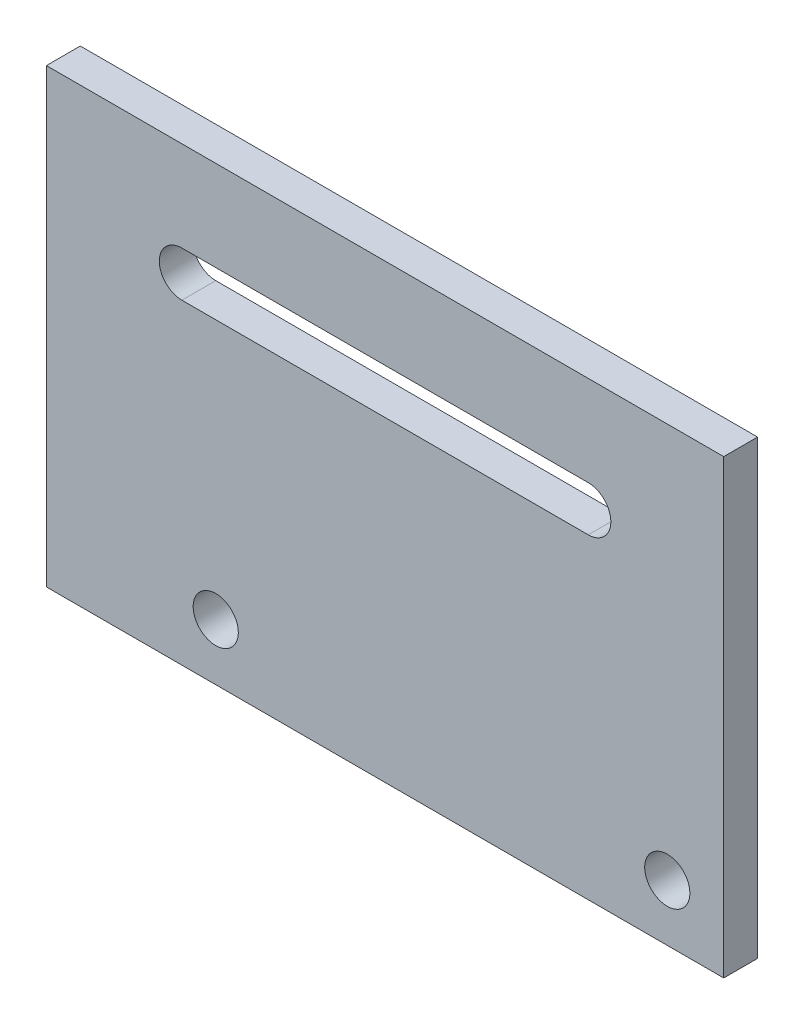
ISO-10303-21;
HEADER;
FILE_DESCRIPTION(('STEP AP214'),'2;1');
FILE_NAME('part.step','',(''),(''),'','','');
FILE_SCHEMA(('AUTOMOTIVE_DESIGN { 1 0 10303 214 1 1 1 1 }'));
ENDSEC;
DATA;
#1=APPLICATION_CONTEXT('core data for automotive mechanical design processes');
#2=APPLICATION_PROTOCOL_DEFINITION('international standard','automotive_design',2000,#1);
#3=PRODUCT_CONTEXT('',#1,'mechanical');
#4=PRODUCT('Part','Part','',(#3));
#5=PRODUCT_RELATED_PRODUCT_CATEGORY('part','',(#4));
#6=PRODUCT_DEFINITION_FORMATION('','',#4);
#7=PRODUCT_DEFINITION_CONTEXT('part definition',#1,'design');
#8=PRODUCT_DEFINITION('design','',#6,#7);
#9=PRODUCT_DEFINITION_SHAPE('','',#8);
#10=(LENGTH_UNIT() NAMED_UNIT(*) SI_UNIT(.MILLI.,.METRE.));
#11=(NAMED_UNIT(*) PLANE_ANGLE_UNIT() SI_UNIT($,.RADIAN.));
#12=(NAMED_UNIT(*) SI_UNIT($,.STERADIAN.) SOLID_ANGLE_UNIT());
#13=UNCERTAINTY_MEASURE_WITH_UNIT(LENGTH_MEASURE(1.E-05),#10,'distance_accuracy_value','');
#14=(GEOMETRIC_REPRESENTATION_CONTEXT(3) GLOBAL_UNCERTAINTY_ASSIGNED_CONTEXT((#13)) GLOBAL_UNIT_ASSIGNED_CONTEXT((#10,
#11,#12)) REPRESENTATION_CONTEXT('',''));
#15=CARTESIAN_POINT('',(0.,0.,0.));
#16=DIRECTION('',(0.,0.,1.));
#17=DIRECTION('',(1.,0.,0.));
#18=AXIS2_PLACEMENT_3D('',#15,#16,#17);
#19=CARTESIAN_POINT('',(-12.2300351362403,2.51555410045674,1.5));
#20=DIRECTION('',(0.,0.,1.));
#21=DIRECTION('',(1.,0.,0.));
#22=AXIS2_PLACEMENT_3D('',#19,#20,#21);
#23=PLANE('',#22);
#24=CARTESIAN_POINT('',(15.2699648637597,5.01555410045673,1.5));
#25=DIRECTION('',(0.,0.,1.));
#26=DIRECTION('',(1.,0.,0.));
#27=AXIS2_PLACEMENT_3D('',#24,#25,#26);
#28=CIRCLE('',#27,1.);
#29=CARTESIAN_POINT('',(16.2699648637597,5.01555410045673,1.5));
#30=VERTEX_POINT('',#29);
#31=EDGE_CURVE('E131',#30,#30,#28,.T.);
#32=ORIENTED_EDGE('',*,*,#31,.F.);
#33=EDGE_LOOP('',(#32));
#34=FACE_BOUND('',#33,.T.);
#35=DIRECTION('',(0.,-1.,0.));
#36=VECTOR('',#35,1.);
#37=CARTESIAN_POINT('',(-12.2300351362403,22.5155541004567,1.5));
#38=LINE('',#37,#36);
#39=CARTESIAN_POINT('',(-12.2300351362403,22.5155541004567,1.5));
#40=VERTEX_POINT('',#39);
#41=CARTESIAN_POINT('',(-12.2300351362403,2.51555410045674,1.5));
#42=VERTEX_POINT('',#41);
#43=EDGE_CURVE('E143',#40,#42,#38,.T.);
#44=ORIENTED_EDGE('',*,*,#43,.T.);
#45=DIRECTION('',(1.,0.,0.));
#46=VECTOR('',#45,1.);
#47=CARTESIAN_POINT('',(-12.2300351362403,2.51555410045674,1.5));
#48=LINE('',#47,#46);
#49=CARTESIAN_POINT('',(17.7699648637597,2.51555410045674,1.5));
#50=VERTEX_POINT('',#49);
#51=EDGE_CURVE('E146',#42,#50,#48,.T.);
#52=ORIENTED_EDGE('',*,*,#51,.T.);
#53=DIRECTION('',(0.,1.,0.));
#54=VECTOR('',#53,1.);
#55=CARTESIAN_POINT('',(17.7699648637597,22.5155541004567,1.5));
#56=LINE('',#55,#54);
#57=CARTESIAN_POINT('',(17.7699648637597,22.5155541004567,1.5));
#58=VERTEX_POINT('',#57);
#59=EDGE_CURVE('E149',#50,#58,#56,.T.);
#60=ORIENTED_EDGE('',*,*,#59,.T.);
#61=DIRECTION('',(-1.,0.,0.));
#62=VECTOR('',#61,1.);
#63=CARTESIAN_POINT('',(-12.2300351362403,22.5155541004567,1.5));
#64=LINE('',#63,#62);
#65=EDGE_CURVE('E151',#58,#40,#64,.T.);
#66=ORIENTED_EDGE('',*,*,#65,.T.);
#67=EDGE_LOOP('',(#44,#52,#60,#66));
#68=FACE_BOUND('',#67,.T.);
#69=CARTESIAN_POINT('',(-4.73003513624028,5.01555410045673,1.5));
#70=DIRECTION('',(0.,0.,1.));
#71=DIRECTION('',(1.,0.,0.));
#72=AXIS2_PLACEMENT_3D('',#69,#70,#71);
#73=CIRCLE('',#72,1.);
#74=CARTESIAN_POINT('',(-3.73003513624028,5.01555410045673,1.5));
#75=VERTEX_POINT('',#74);
#76=EDGE_CURVE('E137',#75,#75,#73,.T.);
#77=ORIENTED_EDGE('',*,*,#76,.F.);
#78=EDGE_LOOP('',(#77));
#79=FACE_BOUND('',#78,.T.);
#80=DIRECTION('',(1.,0.,0.));
#81=VECTOR('',#80,1.);
#82=CARTESIAN_POINT('',(-6.23003513624028,16.5155541004567,1.5));
#83=LINE('',#82,#81);
#84=CARTESIAN_POINT('',(-6.23003513624028,16.5155541004567,1.5));
#85=VERTEX_POINT('',#84);
#86=CARTESIAN_POINT('',(11.7699648637597,16.5155541004567,1.5));
#87=VERTEX_POINT('',#86);
#88=EDGE_CURVE('E103',#85,#87,#83,.T.);
#89=ORIENTED_EDGE('',*,*,#88,.F.);
#90=CARTESIAN_POINT('',(-6.23003513624028,17.5155541004567,1.5));
#91=DIRECTION('',(0.,0.,1.));
#92=DIRECTION('',(1.,0.,0.));
#93=AXIS2_PLACEMENT_3D('',#90,#91,#92);
#94=CIRCLE('',#93,1.);
#95=CARTESIAN_POINT('',(-6.23003513624028,18.5155541004567,1.5));
#96=VERTEX_POINT('',#95);
#97=EDGE_CURVE('E95',#96,#85,#94,.T.);
#98=ORIENTED_EDGE('',*,*,#97,.F.);
#99=DIRECTION('',(-1.,0.,0.));
#100=VECTOR('',#99,1.);
#101=CARTESIAN_POINT('',(-6.23003513624028,18.5155541004567,1.5));
#102=LINE('',#101,#100);
#103=CARTESIAN_POINT('',(11.7699648637597,18.5155541004567,1.5));
#104=VERTEX_POINT('',#103);
#105=EDGE_CURVE('E117',#104,#96,#102,.T.);
#106=ORIENTED_EDGE('',*,*,#105,.F.);
#107=CARTESIAN_POINT('',(11.7699648637597,17.5155541004567,1.5));
#108=DIRECTION('',(0.,0.,1.));
#109=DIRECTION('',(1.,0.,0.));
#110=AXIS2_PLACEMENT_3D('',#107,#108,#109);
#111=CIRCLE('',#110,1.);
#112=EDGE_CURVE('E115',#87,#104,#111,.T.);
#113=ORIENTED_EDGE('',*,*,#112,.F.);
#114=EDGE_LOOP('',(#89,#98,#106,#113));
#115=FACE_BOUND('',#114,.T.);
#116=ADVANCED_FACE('F30',(#34,#68,#79,#115),#23,.T.);
#117=CARTESIAN_POINT('',(-12.2300351362403,2.51555410045674,0.));
#118=DIRECTION('',(0.,0.,1.));
#119=DIRECTION('',(1.,0.,0.));
#120=AXIS2_PLACEMENT_3D('',#117,#118,#119);
#121=PLANE('',#120);
#122=CARTESIAN_POINT('',(15.2699648637597,5.01555410045673,0.));
#123=DIRECTION('',(0.,0.,1.));
#124=DIRECTION('',(1.,0.,0.));
#125=AXIS2_PLACEMENT_3D('',#122,#123,#124);
#126=CIRCLE('',#125,1.);
#127=CARTESIAN_POINT('',(16.2699648637597,5.01555410045673,0.));
#128=VERTEX_POINT('',#127);
#129=EDGE_CURVE('E111',#128,#128,#126,.T.);
#130=ORIENTED_EDGE('',*,*,#129,.T.);
#131=EDGE_LOOP('',(#130));
#132=FACE_BOUND('',#131,.T.);
#133=DIRECTION('',(0.,-1.,0.));
#134=VECTOR('',#133,1.);
#135=CARTESIAN_POINT('',(-12.2300351362403,22.5155541004567,0.));
#136=LINE('',#135,#134);
#137=CARTESIAN_POINT('',(-12.2300351362403,22.5155541004567,0.));
#138=VERTEX_POINT('',#137);
#139=CARTESIAN_POINT('',(-12.2300351362403,2.51555410045674,0.));
#140=VERTEX_POINT('',#139);
#141=EDGE_CURVE('E140',#138,#140,#136,.T.);
#142=ORIENTED_EDGE('',*,*,#141,.F.);
#143=DIRECTION('',(-1.,0.,0.));
#144=VECTOR('',#143,1.);
#145=CARTESIAN_POINT('',(-12.2300351362403,22.5155541004567,0.));
#146=LINE('',#145,#144);
#147=CARTESIAN_POINT('',(17.7699648637597,22.5155541004567,0.));
#148=VERTEX_POINT('',#147);
#149=EDGE_CURVE('E147',#148,#138,#146,.T.);
#150=ORIENTED_EDGE('',*,*,#149,.F.);
#151=DIRECTION('',(0.,1.,0.));
#152=VECTOR('',#151,1.);
#153=CARTESIAN_POINT('',(17.7699648637597,22.5155541004567,0.));
#154=LINE('',#153,#152);
#155=CARTESIAN_POINT('',(17.7699648637597,2.51555410045674,0.));
#156=VERTEX_POINT('',#155);
#157=EDGE_CURVE('E158',#156,#148,#154,.T.);
#158=ORIENTED_EDGE('',*,*,#157,.F.);
#159=DIRECTION('',(1.,0.,0.));
#160=VECTOR('',#159,1.);
#161=CARTESIAN_POINT('',(-12.2300351362403,2.51555410045674,0.));
#162=LINE('',#161,#160);
#163=EDGE_CURVE('E156',#140,#156,#162,.T.);
#164=ORIENTED_EDGE('',*,*,#163,.F.);
#165=EDGE_LOOP('',(#142,#150,#158,#164));
#166=FACE_BOUND('',#165,.T.);
#167=CARTESIAN_POINT('',(-4.73003513624028,5.01555410045673,0.));
#168=DIRECTION('',(0.,0.,1.));
#169=DIRECTION('',(1.,0.,0.));
#170=AXIS2_PLACEMENT_3D('',#167,#168,#169);
#171=CIRCLE('',#170,1.);
#172=CARTESIAN_POINT('',(-3.73003513624028,5.01555410045673,0.));
#173=VERTEX_POINT('',#172);
#174=EDGE_CURVE('E134',#173,#173,#171,.T.);
#175=ORIENTED_EDGE('',*,*,#174,.T.);
#176=EDGE_LOOP('',(#175));
#177=FACE_BOUND('',#176,.T.);
#178=CARTESIAN_POINT('',(-6.23003513624028,17.5155541004567,0.));
#179=DIRECTION('',(0.,0.,1.));
#180=DIRECTION('',(1.,0.,0.));
#181=AXIS2_PLACEMENT_3D('',#178,#179,#180);
#182=CIRCLE('',#181,1.);
#183=CARTESIAN_POINT('',(-6.23003513624028,18.5155541004567,0.));
#184=VERTEX_POINT('',#183);
#185=CARTESIAN_POINT('',(-6.23003513624028,16.5155541004567,0.));
#186=VERTEX_POINT('',#185);
#187=EDGE_CURVE('E53',#184,#186,#182,.T.);
#188=ORIENTED_EDGE('',*,*,#187,.T.);
#189=DIRECTION('',(1.,0.,0.));
#190=VECTOR('',#189,1.);
#191=CARTESIAN_POINT('',(-6.23003513624028,16.5155541004567,0.));
#192=LINE('',#191,#190);
#193=CARTESIAN_POINT('',(11.7699648637597,16.5155541004567,0.));
#194=VERTEX_POINT('',#193);
#195=EDGE_CURVE('E110',#186,#194,#192,.T.);
#196=ORIENTED_EDGE('',*,*,#195,.T.);
#197=CARTESIAN_POINT('',(11.7699648637597,17.5155541004567,0.));
#198=DIRECTION('',(0.,0.,1.));
#199=DIRECTION('',(1.,0.,0.));
#200=AXIS2_PLACEMENT_3D('',#197,#198,#199);
#201=CIRCLE('',#200,1.);
#202=CARTESIAN_POINT('',(11.7699648637597,18.5155541004567,0.));
#203=VERTEX_POINT('',#202);
#204=EDGE_CURVE('E123',#194,#203,#201,.T.);
#205=ORIENTED_EDGE('',*,*,#204,.T.);
#206=DIRECTION('',(-1.,0.,0.));
#207=VECTOR('',#206,1.);
#208=CARTESIAN_POINT('',(-6.23003513624028,18.5155541004567,0.));
#209=LINE('',#208,#207);
#210=EDGE_CURVE('E104',#203,#184,#209,.T.);
#211=ORIENTED_EDGE('',*,*,#210,.T.);
#212=EDGE_LOOP('',(#188,#196,#205,#211));
#213=FACE_BOUND('',#212,.T.);
#214=ADVANCED_FACE('F176',(#132,#166,#177,#213),#121,.F.);
#215=CARTESIAN_POINT('',(-12.2300351362403,22.5155541004567,1.5));
#216=DIRECTION('',(1.,0.,0.));
#217=DIRECTION('',(0.,0.,-1.));
#218=AXIS2_PLACEMENT_3D('',#215,#216,#217);
#219=PLANE('',#218);
#220=ORIENTED_EDGE('',*,*,#141,.T.);
#221=DIRECTION('',(0.,0.,-1.));
#222=VECTOR('',#221,1.);
#223=CARTESIAN_POINT('',(-12.2300351362403,2.51555410045674,1.5));
#224=LINE('',#223,#222);
#225=EDGE_CURVE('E11',#42,#140,#224,.T.);
#226=ORIENTED_EDGE('',*,*,#225,.F.);
#227=ORIENTED_EDGE('',*,*,#43,.F.);
#228=DIRECTION('',(0.,0.,-1.));
#229=VECTOR('',#228,1.);
#230=CARTESIAN_POINT('',(-12.2300351362403,22.5155541004567,1.5));
#231=LINE('',#230,#229);
#232=EDGE_CURVE('E153',#40,#138,#231,.T.);
#233=ORIENTED_EDGE('',*,*,#232,.T.);
#234=EDGE_LOOP('',(#220,#226,#227,#233));
#235=FACE_BOUND('',#234,.T.);
#236=ADVANCED_FACE('F32',(#235),#219,.F.);
#237=CARTESIAN_POINT('',(-12.2300351362403,2.51555410045674,1.5));
#238=DIRECTION('',(0.,1.,0.));
#239=DIRECTION('',(0.,0.,1.));
#240=AXIS2_PLACEMENT_3D('',#237,#238,#239);
#241=PLANE('',#240);
#242=ORIENTED_EDGE('',*,*,#163,.T.);
#243=DIRECTION('',(0.,0.,-1.));
#244=VECTOR('',#243,1.);
#245=CARTESIAN_POINT('',(17.7699648637597,2.51555410045674,1.5));
#246=LINE('',#245,#244);
#247=EDGE_CURVE('E38',#50,#156,#246,.T.);
#248=ORIENTED_EDGE('',*,*,#247,.F.);
#249=ORIENTED_EDGE('',*,*,#51,.F.);
#250=ORIENTED_EDGE('',*,*,#225,.T.);
#251=EDGE_LOOP('',(#242,#248,#249,#250));
#252=FACE_BOUND('',#251,.T.);
#253=ADVANCED_FACE('F187',(#252),#241,.F.);
#254=CARTESIAN_POINT('',(17.7699648637597,22.5155541004567,1.5));
#255=DIRECTION('',(-1.,0.,0.));
#256=DIRECTION('',(0.,-1.,0.));
#257=AXIS2_PLACEMENT_3D('',#254,#255,#256);
#258=PLANE('',#257);
#259=ORIENTED_EDGE('',*,*,#157,.T.);
#260=DIRECTION('',(0.,0.,-1.));
#261=VECTOR('',#260,1.);
#262=CARTESIAN_POINT('',(17.7699648637597,22.5155541004567,1.5));
#263=LINE('',#262,#261);
#264=EDGE_CURVE('E163',#58,#148,#263,.T.);
#265=ORIENTED_EDGE('',*,*,#264,.F.);
#266=ORIENTED_EDGE('',*,*,#59,.F.);
#267=ORIENTED_EDGE('',*,*,#247,.T.);
#268=EDGE_LOOP('',(#259,#265,#266,#267));
#269=FACE_BOUND('',#268,.T.);
#270=ADVANCED_FACE('F170',(#269),#258,.F.);
#271=CARTESIAN_POINT('',(-12.2300351362403,22.5155541004567,1.5));
#272=DIRECTION('',(0.,-1.,0.));
#273=DIRECTION('',(0.,0.,-1.));
#274=AXIS2_PLACEMENT_3D('',#271,#272,#273);
#275=PLANE('',#274);
#276=ORIENTED_EDGE('',*,*,#149,.T.);
#277=ORIENTED_EDGE('',*,*,#232,.F.);
#278=ORIENTED_EDGE('',*,*,#65,.F.);
#279=ORIENTED_EDGE('',*,*,#264,.T.);
#280=EDGE_LOOP('',(#276,#277,#278,#279));
#281=FACE_BOUND('',#280,.T.);
#282=ADVANCED_FACE('F180',(#281),#275,.F.);
#283=CARTESIAN_POINT('',(-4.73003513624028,5.01555410045673,1.5));
#284=DIRECTION('',(0.,0.,-1.));
#285=DIRECTION('',(-1.,0.,0.));
#286=AXIS2_PLACEMENT_3D('',#283,#284,#285);
#287=CYLINDRICAL_SURFACE('',#286,1.);
#288=ORIENTED_EDGE('',*,*,#76,.T.);
#289=EDGE_LOOP('',(#288));
#290=FACE_BOUND('',#289,.T.);
#291=ORIENTED_EDGE('',*,*,#174,.F.);
#292=EDGE_LOOP('',(#291));
#293=FACE_BOUND('',#292,.T.);
#294=ADVANCED_FACE('F204',(#290,#293),#287,.F.);
#295=CARTESIAN_POINT('',(15.2699648637597,5.01555410045673,1.5));
#296=DIRECTION('',(0.,0.,-1.));
#297=DIRECTION('',(-1.,0.,0.));
#298=AXIS2_PLACEMENT_3D('',#295,#296,#297);
#299=CYLINDRICAL_SURFACE('',#298,1.);
#300=ORIENTED_EDGE('',*,*,#31,.T.);
#301=EDGE_LOOP('',(#300));
#302=FACE_BOUND('',#301,.T.);
#303=ORIENTED_EDGE('',*,*,#129,.F.);
#304=EDGE_LOOP('',(#303));
#305=FACE_BOUND('',#304,.T.);
#306=ADVANCED_FACE('F211',(#302,#305),#299,.F.);
#307=CARTESIAN_POINT('',(-6.23003513624028,17.5155541004567,1.5));
#308=DIRECTION('',(0.,0.,-1.));
#309=DIRECTION('',(-1.,0.,0.));
#310=AXIS2_PLACEMENT_3D('',#307,#308,#309);
#311=CYLINDRICAL_SURFACE('',#310,1.);
#312=ORIENTED_EDGE('',*,*,#187,.F.);
#313=DIRECTION('',(0.,0.,-1.));
#314=VECTOR('',#313,1.);
#315=CARTESIAN_POINT('',(-6.23003513624028,18.5155541004567,1.5));
#316=LINE('',#315,#314);
#317=EDGE_CURVE('E99',#96,#184,#316,.T.);
#318=ORIENTED_EDGE('',*,*,#317,.F.);
#319=ORIENTED_EDGE('',*,*,#97,.T.);
#320=DIRECTION('',(0.,0.,-1.));
#321=VECTOR('',#320,1.);
#322=CARTESIAN_POINT('',(-6.23003513624028,16.5155541004567,1.5));
#323=LINE('',#322,#321);
#324=EDGE_CURVE('E98',#85,#186,#323,.T.);
#325=ORIENTED_EDGE('',*,*,#324,.T.);
#326=EDGE_LOOP('',(#312,#318,#319,#325));
#327=FACE_BOUND('',#326,.T.);
#328=ADVANCED_FACE('F97',(#327),#311,.F.);
#329=CARTESIAN_POINT('',(-6.23003513624028,16.5155541004567,1.5));
#330=DIRECTION('',(0.,1.,0.));
#331=DIRECTION('',(-1.,0.,0.));
#332=AXIS2_PLACEMENT_3D('',#329,#330,#331);
#333=PLANE('',#332);
#334=ORIENTED_EDGE('',*,*,#195,.F.);
#335=ORIENTED_EDGE('',*,*,#324,.F.);
#336=ORIENTED_EDGE('',*,*,#88,.T.);
#337=DIRECTION('',(0.,0.,-1.));
#338=VECTOR('',#337,1.);
#339=CARTESIAN_POINT('',(11.7699648637597,16.5155541004567,1.5));
#340=LINE('',#339,#338);
#341=EDGE_CURVE('E112',#87,#194,#340,.T.);
#342=ORIENTED_EDGE('',*,*,#341,.T.);
#343=EDGE_LOOP('',(#334,#335,#336,#342));
#344=FACE_BOUND('',#343,.T.);
#345=ADVANCED_FACE('F107',(#344),#333,.T.);
#346=CARTESIAN_POINT('',(11.7699648637597,17.5155541004567,1.5));
#347=DIRECTION('',(0.,0.,-1.));
#348=DIRECTION('',(-1.,0.,0.));
#349=AXIS2_PLACEMENT_3D('',#346,#347,#348);
#350=CYLINDRICAL_SURFACE('',#349,1.);
#351=ORIENTED_EDGE('',*,*,#204,.F.);
#352=ORIENTED_EDGE('',*,*,#341,.F.);
#353=ORIENTED_EDGE('',*,*,#112,.T.);
#354=DIRECTION('',(0.,0.,-1.));
#355=VECTOR('',#354,1.);
#356=CARTESIAN_POINT('',(11.7699648637597,18.5155541004567,1.5));
#357=LINE('',#356,#355);
#358=EDGE_CURVE('E45',#104,#203,#357,.T.);
#359=ORIENTED_EDGE('',*,*,#358,.T.);
#360=EDGE_LOOP('',(#351,#352,#353,#359));
#361=FACE_BOUND('',#360,.T.);
#362=ADVANCED_FACE('F224',(#361),#350,.F.);
#363=CARTESIAN_POINT('',(-6.23003513624028,18.5155541004567,1.5));
#364=DIRECTION('',(0.,-1.,0.));
#365=DIRECTION('',(1.,0.,0.));
#366=AXIS2_PLACEMENT_3D('',#363,#364,#365);
#367=PLANE('',#366);
#368=ORIENTED_EDGE('',*,*,#210,.F.);
#369=ORIENTED_EDGE('',*,*,#358,.F.);
#370=ORIENTED_EDGE('',*,*,#105,.T.);
#371=ORIENTED_EDGE('',*,*,#317,.T.);
#372=EDGE_LOOP('',(#368,#369,#370,#371));
#373=FACE_BOUND('',#372,.T.);
#374=ADVANCED_FACE('F222',(#373),#367,.T.);
#375=CLOSED_SHELL('',(#116,#214,#236,#253,#270,#282,#294,#306,#328,#345,#362,#374));
#376=MANIFOLD_SOLID_BREP('B2',#375);
#377=ADVANCED_BREP_SHAPE_REPRESENTATION('',(#18,#376),#14);
#378=SHAPE_DEFINITION_REPRESENTATION(#9,#377);
ENDSEC;
END-ISO-10303-21;
